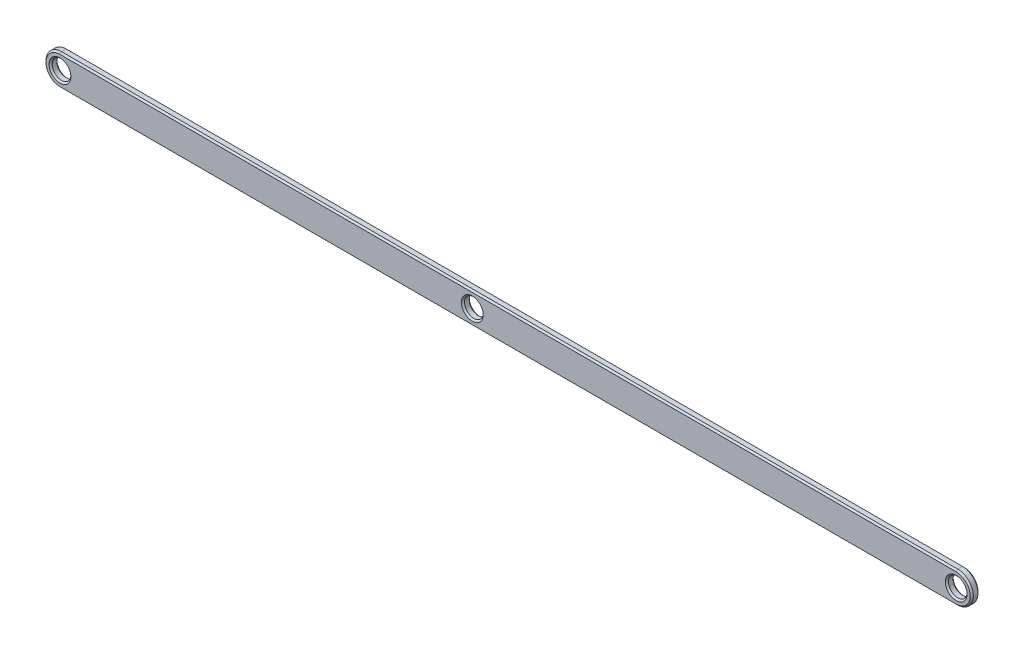
ISO-10303-21;
HEADER;
FILE_DESCRIPTION(('STEP AP214'),'2;1');
FILE_NAME('part.step','',(''),(''),'','','');
FILE_SCHEMA(('AUTOMOTIVE_DESIGN { 1 0 10303 214 1 1 1 1 }'));
ENDSEC;
DATA;
#1=APPLICATION_CONTEXT('core data for automotive mechanical design processes');
#2=APPLICATION_PROTOCOL_DEFINITION('international standard','automotive_design',2000,#1);
#3=PRODUCT_CONTEXT('',#1,'mechanical');
#4=PRODUCT('Part','Part','',(#3));
#5=PRODUCT_RELATED_PRODUCT_CATEGORY('part','',(#4));
#6=PRODUCT_DEFINITION_FORMATION('','',#4);
#7=PRODUCT_DEFINITION_CONTEXT('part definition',#1,'design');
#8=PRODUCT_DEFINITION('design','',#6,#7);
#9=PRODUCT_DEFINITION_SHAPE('','',#8);
#10=(LENGTH_UNIT() NAMED_UNIT(*) SI_UNIT(.MILLI.,.METRE.));
#11=(NAMED_UNIT(*) PLANE_ANGLE_UNIT() SI_UNIT($,.RADIAN.));
#12=(NAMED_UNIT(*) SI_UNIT($,.STERADIAN.) SOLID_ANGLE_UNIT());
#13=UNCERTAINTY_MEASURE_WITH_UNIT(LENGTH_MEASURE(1.E-05),#10,'distance_accuracy_value','');
#14=(GEOMETRIC_REPRESENTATION_CONTEXT(3) GLOBAL_UNCERTAINTY_ASSIGNED_CONTEXT((#13)) GLOBAL_UNIT_ASSIGNED_CONTEXT((#10,
#11,#12)) REPRESENTATION_CONTEXT('',''));
#15=CARTESIAN_POINT('',(0.,0.,0.));
#16=DIRECTION('',(0.,0.,1.));
#17=DIRECTION('',(1.,0.,0.));
#18=AXIS2_PLACEMENT_3D('',#15,#16,#17);
#19=CARTESIAN_POINT('',(-1440.,0.,25.));
#20=DIRECTION('',(0.,0.,1.));
#21=DIRECTION('',(1.,0.,0.));
#22=AXIS2_PLACEMENT_3D('',#19,#20,#21);
#23=PLANE('',#22);
#24=CARTESIAN_POINT('',(-115.,0.,25.));
#25=DIRECTION('',(0.,0.,1.));
#26=DIRECTION('',(1.,0.,0.));
#27=AXIS2_PLACEMENT_3D('',#24,#25,#26);
#28=CIRCLE('',#27,35.0000000000001);
#29=CARTESIAN_POINT('',(-79.9999999999998,0.,25.));
#30=VERTEX_POINT('',#29);
#31=EDGE_CURVE('E11',#30,#30,#28,.F.);
#32=ORIENTED_EDGE('',*,*,#31,.T.);
#33=EDGE_LOOP('',(#32));
#34=FACE_BOUND('',#33,.T.);
#35=CARTESIAN_POINT('',(-1440.,0.,25.));
#36=DIRECTION('',(0.,0.,1.));
#37=DIRECTION('',(1.,0.,0.));
#38=AXIS2_PLACEMENT_3D('',#35,#36,#37);
#39=CIRCLE('',#38,35.0000000000001);
#40=CARTESIAN_POINT('',(-1405.,0.,25.));
#41=VERTEX_POINT('',#40);
#42=EDGE_CURVE('E50',#41,#41,#39,.F.);
#43=ORIENTED_EDGE('',*,*,#42,.T.);
#44=EDGE_LOOP('',(#43));
#45=FACE_BOUND('',#44,.T.);
#46=CARTESIAN_POINT('',(1440.,3.52698278154438E-13,25.));
#47=DIRECTION('',(0.,0.,1.));
#48=DIRECTION('',(1.,0.,0.));
#49=AXIS2_PLACEMENT_3D('',#46,#47,#48);
#50=CIRCLE('',#49,45.0000000000008);
#51=CARTESIAN_POINT('',(1440.,-45.0000000000005,25.));
#52=VERTEX_POINT('',#51);
#53=CARTESIAN_POINT('',(1440.,45.0000000000012,25.));
#54=VERTEX_POINT('',#53);
#55=EDGE_CURVE('E58',#52,#54,#50,.T.);
#56=ORIENTED_EDGE('',*,*,#55,.T.);
#57=DIRECTION('',(-1.,0.,0.));
#58=VECTOR('',#57,1.);
#59=CARTESIAN_POINT('',(-1440.,45.0000000000008,25.));
#60=LINE('',#59,#58);
#61=CARTESIAN_POINT('',(-1440.,45.0000000000008,25.));
#62=VERTEX_POINT('',#61);
#63=EDGE_CURVE('E214',#54,#62,#60,.T.);
#64=ORIENTED_EDGE('',*,*,#63,.T.);
#65=CARTESIAN_POINT('',(-1440.,0.,25.));
#66=DIRECTION('',(0.,0.,1.));
#67=DIRECTION('',(1.,0.,0.));
#68=AXIS2_PLACEMENT_3D('',#65,#66,#67);
#69=CIRCLE('',#68,45.0000000000008);
#70=CARTESIAN_POINT('',(-1440.,-45.0000000000008,25.));
#71=VERTEX_POINT('',#70);
#72=EDGE_CURVE('E207',#62,#71,#69,.T.);
#73=ORIENTED_EDGE('',*,*,#72,.T.);
#74=DIRECTION('',(1.,0.,0.));
#75=VECTOR('',#74,1.);
#76=CARTESIAN_POINT('',(1440.,-45.0000000000005,25.));
#77=LINE('',#76,#75);
#78=EDGE_CURVE('E63',#71,#52,#77,.T.);
#79=ORIENTED_EDGE('',*,*,#78,.T.);
#80=EDGE_LOOP('',(#56,#64,#73,#79));
#81=FACE_BOUND('',#80,.T.);
#82=CARTESIAN_POINT('',(1440.,3.52698278154438E-13,25.));
#83=DIRECTION('',(0.,0.,1.));
#84=DIRECTION('',(1.,0.,0.));
#85=AXIS2_PLACEMENT_3D('',#82,#83,#84);
#86=CIRCLE('',#85,35.0000000000001);
#87=CARTESIAN_POINT('',(1475.,3.52698278154438E-13,25.));
#88=VERTEX_POINT('',#87);
#89=EDGE_CURVE('E203',#88,#88,#86,.F.);
#90=ORIENTED_EDGE('',*,*,#89,.T.);
#91=EDGE_LOOP('',(#90));
#92=FACE_BOUND('',#91,.T.);
#93=ADVANCED_FACE('F40',(#34,#45,#81,#92),#23,.T.);
#94=CARTESIAN_POINT('',(-1440.,0.,0.));
#95=DIRECTION('',(0.,0.,1.));
#96=DIRECTION('',(1.,0.,0.));
#97=AXIS2_PLACEMENT_3D('',#94,#95,#96);
#98=PLANE('',#97);
#99=CARTESIAN_POINT('',(-115.,0.,0.));
#100=DIRECTION('',(0.,0.,1.));
#101=DIRECTION('',(1.,0.,0.));
#102=AXIS2_PLACEMENT_3D('',#99,#100,#101);
#103=CIRCLE('',#102,35.0000000000001);
#104=CARTESIAN_POINT('',(-79.9999999999998,0.,0.));
#105=VERTEX_POINT('',#104);
#106=EDGE_CURVE('E151',#105,#105,#103,.T.);
#107=ORIENTED_EDGE('',*,*,#106,.T.);
#108=EDGE_LOOP('',(#107));
#109=FACE_BOUND('',#108,.T.);
#110=CARTESIAN_POINT('',(1440.,3.52698278154438E-13,0.));
#111=DIRECTION('',(0.,0.,1.));
#112=DIRECTION('',(1.,0.,0.));
#113=AXIS2_PLACEMENT_3D('',#110,#111,#112);
#114=CIRCLE('',#113,35.0000000000001);
#115=CARTESIAN_POINT('',(1475.,3.52698278154438E-13,0.));
#116=VERTEX_POINT('',#115);
#117=EDGE_CURVE('E143',#116,#116,#114,.T.);
#118=ORIENTED_EDGE('',*,*,#117,.T.);
#119=EDGE_LOOP('',(#118));
#120=FACE_BOUND('',#119,.T.);
#121=CARTESIAN_POINT('',(-1440.,0.,0.));
#122=DIRECTION('',(0.,0.,1.));
#123=DIRECTION('',(1.,0.,0.));
#124=AXIS2_PLACEMENT_3D('',#121,#122,#123);
#125=CIRCLE('',#124,35.0000000000001);
#126=CARTESIAN_POINT('',(-1405.,0.,0.));
#127=VERTEX_POINT('',#126);
#128=EDGE_CURVE('E138',#127,#127,#125,.T.);
#129=ORIENTED_EDGE('',*,*,#128,.T.);
#130=EDGE_LOOP('',(#129));
#131=FACE_BOUND('',#130,.T.);
#132=CARTESIAN_POINT('',(1440.,3.52698278154438E-13,0.));
#133=DIRECTION('',(0.,0.,1.));
#134=DIRECTION('',(1.,0.,0.));
#135=AXIS2_PLACEMENT_3D('',#132,#133,#134);
#136=CIRCLE('',#135,44.9999999999999);
#137=CARTESIAN_POINT('',(1440.,45.0000000000003,0.));
#138=VERTEX_POINT('',#137);
#139=CARTESIAN_POINT('',(1440.,-44.9999999999996,0.));
#140=VERTEX_POINT('',#139);
#141=EDGE_CURVE('E136',#138,#140,#136,.F.);
#142=ORIENTED_EDGE('',*,*,#141,.T.);
#143=DIRECTION('',(-1.,0.,0.));
#144=VECTOR('',#143,1.);
#145=CARTESIAN_POINT('',(-1440.,-44.9999999999999,0.));
#146=LINE('',#145,#144);
#147=CARTESIAN_POINT('',(-1440.,-44.9999999999999,0.));
#148=VERTEX_POINT('',#147);
#149=EDGE_CURVE('E113',#140,#148,#146,.T.);
#150=ORIENTED_EDGE('',*,*,#149,.T.);
#151=CARTESIAN_POINT('',(-1440.,0.,0.));
#152=DIRECTION('',(0.,0.,1.));
#153=DIRECTION('',(1.,0.,0.));
#154=AXIS2_PLACEMENT_3D('',#151,#152,#153);
#155=CIRCLE('',#154,44.9999999999999);
#156=CARTESIAN_POINT('',(-1440.,44.9999999999999,0.));
#157=VERTEX_POINT('',#156);
#158=EDGE_CURVE('E124',#148,#157,#155,.F.);
#159=ORIENTED_EDGE('',*,*,#158,.T.);
#160=DIRECTION('',(1.,0.,0.));
#161=VECTOR('',#160,1.);
#162=CARTESIAN_POINT('',(-1440.,44.9999999999999,0.));
#163=LINE('',#162,#161);
#164=EDGE_CURVE('E131',#157,#138,#163,.T.);
#165=ORIENTED_EDGE('',*,*,#164,.T.);
#166=EDGE_LOOP('',(#142,#150,#159,#165));
#167=FACE_BOUND('',#166,.T.);
#168=ADVANCED_FACE('F134',(#109,#120,#131,#167),#98,.F.);
#169=CARTESIAN_POINT('',(-1440.,0.,25.));
#170=DIRECTION('',(0.,0.,-1.));
#171=DIRECTION('',(-1.,0.,0.));
#172=AXIS2_PLACEMENT_3D('',#169,#170,#171);
#173=CYLINDRICAL_SURFACE('',#172,50.0000000000001);
#174=DIRECTION('',(0.,0.,-1.));
#175=VECTOR('',#174,1.);
#176=CARTESIAN_POINT('',(-1440.,50.,25.));
#177=LINE('',#176,#175);
#178=CARTESIAN_POINT('',(-1440.,50.,20.0000000000005));
#179=VERTEX_POINT('',#178);
#180=CARTESIAN_POINT('',(-1440.,50.,4.99999999999996));
#181=VERTEX_POINT('',#180);
#182=EDGE_CURVE('E227',#179,#181,#177,.T.);
#183=ORIENTED_EDGE('',*,*,#182,.T.);
#184=CARTESIAN_POINT('',(-1440.,0.,4.99999999999996));
#185=DIRECTION('',(0.,0.,1.));
#186=DIRECTION('',(1.,0.,0.));
#187=AXIS2_PLACEMENT_3D('',#184,#185,#186);
#188=CIRCLE('',#187,50.0000000000001);
#189=CARTESIAN_POINT('',(-1440.,-50.0000000000001,4.99999999999996));
#190=VERTEX_POINT('',#189);
#191=EDGE_CURVE('E200',#181,#190,#188,.T.);
#192=ORIENTED_EDGE('',*,*,#191,.T.);
#193=DIRECTION('',(0.,0.,-1.));
#194=VECTOR('',#193,1.);
#195=CARTESIAN_POINT('',(-1440.,-50.0000000000001,25.));
#196=LINE('',#195,#194);
#197=CARTESIAN_POINT('',(-1440.,-50.0000000000001,20.0000000000005));
#198=VERTEX_POINT('',#197);
#199=EDGE_CURVE('E132',#198,#190,#196,.T.);
#200=ORIENTED_EDGE('',*,*,#199,.F.);
#201=CARTESIAN_POINT('',(-1440.,0.,20.0000000000005));
#202=DIRECTION('',(0.,0.,1.));
#203=DIRECTION('',(1.,0.,0.));
#204=AXIS2_PLACEMENT_3D('',#201,#202,#203);
#205=CIRCLE('',#204,50.0000000000001);
#206=EDGE_CURVE('E197',#198,#179,#205,.F.);
#207=ORIENTED_EDGE('',*,*,#206,.T.);
#208=EDGE_LOOP('',(#183,#192,#200,#207));
#209=FACE_BOUND('',#208,.T.);
#210=ADVANCED_FACE('F257',(#209),#173,.T.);
#211=CARTESIAN_POINT('',(1440.,-49.9999999999997,25.));
#212=DIRECTION('',(0.,1.,0.));
#213=DIRECTION('',(-1.,0.,0.));
#214=AXIS2_PLACEMENT_3D('',#211,#212,#213);
#215=PLANE('',#214);
#216=ORIENTED_EDGE('',*,*,#199,.T.);
#217=DIRECTION('',(1.,0.,0.));
#218=VECTOR('',#217,1.);
#219=CARTESIAN_POINT('',(1440.,-49.9999999999997,4.99999999999996));
#220=LINE('',#219,#218);
#221=CARTESIAN_POINT('',(1440.,-49.9999999999997,4.99999999999996));
#222=VERTEX_POINT('',#221);
#223=EDGE_CURVE('E116',#190,#222,#220,.T.);
#224=ORIENTED_EDGE('',*,*,#223,.T.);
#225=DIRECTION('',(0.,0.,-1.));
#226=VECTOR('',#225,1.);
#227=CARTESIAN_POINT('',(1440.,-49.9999999999997,25.));
#228=LINE('',#227,#226);
#229=CARTESIAN_POINT('',(1440.,-49.9999999999997,20.0000000000005));
#230=VERTEX_POINT('',#229);
#231=EDGE_CURVE('E254',#230,#222,#228,.T.);
#232=ORIENTED_EDGE('',*,*,#231,.F.);
#233=DIRECTION('',(-1.,0.,0.));
#234=VECTOR('',#233,1.);
#235=CARTESIAN_POINT('',(-1440.,-50.0000000000001,20.0000000000005));
#236=LINE('',#235,#234);
#237=EDGE_CURVE('E179',#230,#198,#236,.T.);
#238=ORIENTED_EDGE('',*,*,#237,.T.);
#239=EDGE_LOOP('',(#216,#224,#232,#238));
#240=FACE_BOUND('',#239,.T.);
#241=ADVANCED_FACE('F252',(#240),#215,.F.);
#242=CARTESIAN_POINT('',(1440.,3.52698278154438E-13,25.));
#243=DIRECTION('',(0.,0.,-1.));
#244=DIRECTION('',(-1.,0.,0.));
#245=AXIS2_PLACEMENT_3D('',#242,#243,#244);
#246=CYLINDRICAL_SURFACE('',#245,50.0000000000001);
#247=ORIENTED_EDGE('',*,*,#231,.T.);
#248=CARTESIAN_POINT('',(1440.,3.52698278154438E-13,4.99999999999996));
#249=DIRECTION('',(0.,0.,1.));
#250=DIRECTION('',(1.,0.,0.));
#251=AXIS2_PLACEMENT_3D('',#248,#249,#250);
#252=CIRCLE('',#251,50.0000000000001);
#253=CARTESIAN_POINT('',(1440.,50.0000000000004,4.99999999999996));
#254=VERTEX_POINT('',#253);
#255=EDGE_CURVE('E187',#222,#254,#252,.T.);
#256=ORIENTED_EDGE('',*,*,#255,.T.);
#257=DIRECTION('',(0.,0.,-1.));
#258=VECTOR('',#257,1.);
#259=CARTESIAN_POINT('',(1440.,50.0000000000004,25.));
#260=LINE('',#259,#258);
#261=CARTESIAN_POINT('',(1440.,50.0000000000004,20.0000000000005));
#262=VERTEX_POINT('',#261);
#263=EDGE_CURVE('E262',#262,#254,#260,.T.);
#264=ORIENTED_EDGE('',*,*,#263,.F.);
#265=CARTESIAN_POINT('',(1440.,3.52698278154438E-13,20.0000000000005));
#266=DIRECTION('',(0.,0.,1.));
#267=DIRECTION('',(1.,0.,0.));
#268=AXIS2_PLACEMENT_3D('',#265,#266,#267);
#269=CIRCLE('',#268,50.0000000000001);
#270=EDGE_CURVE('E184',#262,#230,#269,.F.);
#271=ORIENTED_EDGE('',*,*,#270,.T.);
#272=EDGE_LOOP('',(#247,#256,#264,#271));
#273=FACE_BOUND('',#272,.T.);
#274=ADVANCED_FACE('F276',(#273),#246,.T.);
#275=CARTESIAN_POINT('',(1440.,50.0000000000004,25.));
#276=DIRECTION('',(0.,-1.,0.));
#277=DIRECTION('',(1.,0.,0.));
#278=AXIS2_PLACEMENT_3D('',#275,#276,#277);
#279=PLANE('',#278);
#280=ORIENTED_EDGE('',*,*,#263,.T.);
#281=DIRECTION('',(-1.,0.,0.));
#282=VECTOR('',#281,1.);
#283=CARTESIAN_POINT('',(1440.,50.0000000000004,4.99999999999996));
#284=LINE('',#283,#282);
#285=EDGE_CURVE('E194',#254,#181,#284,.T.);
#286=ORIENTED_EDGE('',*,*,#285,.T.);
#287=ORIENTED_EDGE('',*,*,#182,.F.);
#288=DIRECTION('',(1.,0.,0.));
#289=VECTOR('',#288,1.);
#290=CARTESIAN_POINT('',(1440.,50.0000000000004,20.0000000000005));
#291=LINE('',#290,#289);
#292=EDGE_CURVE('E190',#179,#262,#291,.T.);
#293=ORIENTED_EDGE('',*,*,#292,.T.);
#294=EDGE_LOOP('',(#280,#286,#287,#293));
#295=FACE_BOUND('',#294,.T.);
#296=ADVANCED_FACE('F282',(#295),#279,.F.);
#297=CARTESIAN_POINT('',(-1440.,0.,25.));
#298=DIRECTION('',(0.,0.,-1.));
#299=DIRECTION('',(-1.,0.,0.));
#300=AXIS2_PLACEMENT_3D('',#297,#298,#299);
#301=CYLINDRICAL_SURFACE('',#300,30.);
#302=CARTESIAN_POINT('',(-1440.,0.,5.0000000000002));
#303=DIRECTION('',(0.,0.,1.));
#304=DIRECTION('',(1.,0.,0.));
#305=AXIS2_PLACEMENT_3D('',#302,#303,#304);
#306=CIRCLE('',#305,30.);
#307=CARTESIAN_POINT('',(-1410.,0.,5.0000000000002));
#308=VERTEX_POINT('',#307);
#309=EDGE_CURVE('E175',#308,#308,#306,.F.);
#310=ORIENTED_EDGE('',*,*,#309,.T.);
#311=EDGE_LOOP('',(#310));
#312=FACE_BOUND('',#311,.T.);
#313=CARTESIAN_POINT('',(-1440.,0.,20.0000000000002));
#314=DIRECTION('',(0.,0.,1.));
#315=DIRECTION('',(1.,0.,0.));
#316=AXIS2_PLACEMENT_3D('',#313,#314,#315);
#317=CIRCLE('',#316,30.);
#318=CARTESIAN_POINT('',(-1410.,0.,20.0000000000002));
#319=VERTEX_POINT('',#318);
#320=EDGE_CURVE('E171',#319,#319,#317,.T.);
#321=ORIENTED_EDGE('',*,*,#320,.T.);
#322=EDGE_LOOP('',(#321));
#323=FACE_BOUND('',#322,.T.);
#324=ADVANCED_FACE('F301',(#312,#323),#301,.F.);
#325=CARTESIAN_POINT('',(1440.,3.52698278154438E-13,25.));
#326=DIRECTION('',(0.,0.,-1.));
#327=DIRECTION('',(-1.,0.,0.));
#328=AXIS2_PLACEMENT_3D('',#325,#326,#327);
#329=CYLINDRICAL_SURFACE('',#328,30.);
#330=CARTESIAN_POINT('',(1440.,3.52698278154438E-13,5.0000000000002));
#331=DIRECTION('',(0.,0.,1.));
#332=DIRECTION('',(1.,0.,0.));
#333=AXIS2_PLACEMENT_3D('',#330,#331,#332);
#334=CIRCLE('',#333,30.);
#335=CARTESIAN_POINT('',(1470.,3.52698278154438E-13,5.0000000000002));
#336=VERTEX_POINT('',#335);
#337=EDGE_CURVE('E167',#336,#336,#334,.F.);
#338=ORIENTED_EDGE('',*,*,#337,.T.);
#339=EDGE_LOOP('',(#338));
#340=FACE_BOUND('',#339,.T.);
#341=CARTESIAN_POINT('',(1440.,3.52698278154438E-13,20.0000000000002));
#342=DIRECTION('',(0.,0.,1.));
#343=DIRECTION('',(1.,0.,0.));
#344=AXIS2_PLACEMENT_3D('',#341,#342,#343);
#345=CIRCLE('',#344,30.);
#346=CARTESIAN_POINT('',(1470.,3.52698278154438E-13,20.0000000000002));
#347=VERTEX_POINT('',#346);
#348=EDGE_CURVE('E163',#347,#347,#345,.T.);
#349=ORIENTED_EDGE('',*,*,#348,.T.);
#350=EDGE_LOOP('',(#349));
#351=FACE_BOUND('',#350,.T.);
#352=ADVANCED_FACE('F298',(#340,#351),#329,.F.);
#353=CARTESIAN_POINT('',(-115.,0.,25.));
#354=DIRECTION('',(0.,0.,-1.));
#355=DIRECTION('',(-1.,0.,0.));
#356=AXIS2_PLACEMENT_3D('',#353,#354,#355);
#357=CYLINDRICAL_SURFACE('',#356,30.0000000000001);
#358=CARTESIAN_POINT('',(-115.,0.,5.00000000000031));
#359=DIRECTION('',(0.,0.,1.));
#360=DIRECTION('',(1.,0.,0.));
#361=AXIS2_PLACEMENT_3D('',#358,#359,#360);
#362=CIRCLE('',#361,30.0000000000001);
#363=CARTESIAN_POINT('',(-84.9999999999999,0.,5.00000000000031));
#364=VERTEX_POINT('',#363);
#365=EDGE_CURVE('E159',#364,#364,#362,.F.);
#366=ORIENTED_EDGE('',*,*,#365,.T.);
#367=EDGE_LOOP('',(#366));
#368=FACE_BOUND('',#367,.T.);
#369=CARTESIAN_POINT('',(-115.,0.,20.0000000000003));
#370=DIRECTION('',(0.,0.,1.));
#371=DIRECTION('',(1.,0.,0.));
#372=AXIS2_PLACEMENT_3D('',#369,#370,#371);
#373=CIRCLE('',#372,30.0000000000001);
#374=CARTESIAN_POINT('',(-84.9999999999999,0.,20.0000000000003));
#375=VERTEX_POINT('',#374);
#376=EDGE_CURVE('E155',#375,#375,#373,.T.);
#377=ORIENTED_EDGE('',*,*,#376,.T.);
#378=EDGE_LOOP('',(#377));
#379=FACE_BOUND('',#378,.T.);
#380=ADVANCED_FACE('F300',(#368,#379),#357,.F.);
#381=CARTESIAN_POINT('',(-115.,0.,0.));
#382=DIRECTION('',(0.,0.,-1.));
#383=DIRECTION('',(-1.,0.,0.));
#384=AXIS2_PLACEMENT_3D('',#381,#382,#383);
#385=CONICAL_SURFACE('',#384,35.0000000000001,0.785398163397426);
#386=ORIENTED_EDGE('',*,*,#365,.F.);
#387=EDGE_LOOP('',(#386));
#388=FACE_BOUND('',#387,.T.);
#389=ORIENTED_EDGE('',*,*,#106,.F.);
#390=EDGE_LOOP('',(#389));
#391=FACE_BOUND('',#390,.T.);
#392=ADVANCED_FACE('F308',(#388,#391),#385,.F.);
#393=CARTESIAN_POINT('',(1440.,3.52698278154438E-13,0.));
#394=DIRECTION('',(0.,0.,-1.));
#395=DIRECTION('',(-1.,0.,0.));
#396=AXIS2_PLACEMENT_3D('',#393,#394,#395);
#397=CONICAL_SURFACE('',#396,35.0000000000001,0.785398163397438);
#398=ORIENTED_EDGE('',*,*,#337,.F.);
#399=EDGE_LOOP('',(#398));
#400=FACE_BOUND('',#399,.T.);
#401=ORIENTED_EDGE('',*,*,#117,.F.);
#402=EDGE_LOOP('',(#401));
#403=FACE_BOUND('',#402,.T.);
#404=ADVANCED_FACE('F327',(#400,#403),#397,.F.);
#405=CARTESIAN_POINT('',(-1440.,0.,0.));
#406=DIRECTION('',(0.,0.,-1.));
#407=DIRECTION('',(-1.,0.,0.));
#408=AXIS2_PLACEMENT_3D('',#405,#406,#407);
#409=CONICAL_SURFACE('',#408,35.0000000000001,0.785398163397438);
#410=ORIENTED_EDGE('',*,*,#309,.F.);
#411=EDGE_LOOP('',(#410));
#412=FACE_BOUND('',#411,.T.);
#413=ORIENTED_EDGE('',*,*,#128,.F.);
#414=EDGE_LOOP('',(#413));
#415=FACE_BOUND('',#414,.T.);
#416=ADVANCED_FACE('F331',(#412,#415),#409,.F.);
#417=CARTESIAN_POINT('',(1440.,50.0000000000004,4.99999999999996));
#418=DIRECTION('',(0.,-0.707106781186536,0.707106781186559));
#419=DIRECTION('',(-1.,0.,0.));
#420=AXIS2_PLACEMENT_3D('',#417,#418,#419);
#421=PLANE('',#420);
#422=DIRECTION('',(0.,0.707106781186559,0.707106781186536));
#423=VECTOR('',#422,1.);
#424=CARTESIAN_POINT('',(1440.,45.0000000000003,0.));
#425=LINE('',#424,#423);
#426=EDGE_CURVE('E120',#138,#254,#425,.T.);
#427=ORIENTED_EDGE('',*,*,#426,.F.);
#428=ORIENTED_EDGE('',*,*,#164,.F.);
#429=DIRECTION('',(0.,-0.707106781186559,-0.707106781186536));
#430=VECTOR('',#429,1.);
#431=CARTESIAN_POINT('',(-1440.,50.,4.99999999999996));
#432=LINE('',#431,#430);
#433=EDGE_CURVE('E127',#181,#157,#432,.T.);
#434=ORIENTED_EDGE('',*,*,#433,.F.);
#435=ORIENTED_EDGE('',*,*,#285,.F.);
#436=EDGE_LOOP('',(#427,#428,#434,#435));
#437=FACE_BOUND('',#436,.T.);
#438=ADVANCED_FACE('F269',(#437),#421,.F.);
#439=CARTESIAN_POINT('',(-1440.,0.,4.99999999999996));
#440=DIRECTION('',(0.,0.,1.));
#441=DIRECTION('',(1.,0.,0.));
#442=AXIS2_PLACEMENT_3D('',#439,#440,#441);
#443=CONICAL_SURFACE('',#442,50.0000000000001,0.785398163397464);
#444=ORIENTED_EDGE('',*,*,#433,.T.);
#445=ORIENTED_EDGE('',*,*,#158,.F.);
#446=DIRECTION('',(0.,0.707106781186559,-0.707106781186536));
#447=VECTOR('',#446,1.);
#448=CARTESIAN_POINT('',(-1440.,-50.0000000000001,4.99999999999996));
#449=LINE('',#448,#447);
#450=EDGE_CURVE('E109',#190,#148,#449,.T.);
#451=ORIENTED_EDGE('',*,*,#450,.F.);
#452=ORIENTED_EDGE('',*,*,#191,.F.);
#453=EDGE_LOOP('',(#444,#445,#451,#452));
#454=FACE_BOUND('',#453,.T.);
#455=ADVANCED_FACE('F125',(#454),#443,.T.);
#456=CARTESIAN_POINT('',(1440.,3.52698278154438E-13,4.99999999999996));
#457=DIRECTION('',(0.,0.,1.));
#458=DIRECTION('',(1.,0.,0.));
#459=AXIS2_PLACEMENT_3D('',#456,#457,#458);
#460=CONICAL_SURFACE('',#459,50.0000000000001,0.785398163397464);
#461=ORIENTED_EDGE('',*,*,#426,.T.);
#462=ORIENTED_EDGE('',*,*,#255,.F.);
#463=DIRECTION('',(0.,-0.707106781186559,0.707106781186536));
#464=VECTOR('',#463,1.);
#465=CARTESIAN_POINT('',(1440.,-44.9999999999996,0.));
#466=LINE('',#465,#464);
#467=EDGE_CURVE('E121',#140,#222,#466,.T.);
#468=ORIENTED_EDGE('',*,*,#467,.F.);
#469=ORIENTED_EDGE('',*,*,#141,.F.);
#470=EDGE_LOOP('',(#461,#462,#468,#469));
#471=FACE_BOUND('',#470,.T.);
#472=ADVANCED_FACE('F272',(#471),#460,.T.);
#473=CARTESIAN_POINT('',(1440.,-49.9999999999997,4.99999999999996));
#474=DIRECTION('',(0.,0.707106781186536,0.707106781186559));
#475=DIRECTION('',(1.,0.,0.));
#476=AXIS2_PLACEMENT_3D('',#473,#474,#475);
#477=PLANE('',#476);
#478=ORIENTED_EDGE('',*,*,#450,.T.);
#479=ORIENTED_EDGE('',*,*,#149,.F.);
#480=ORIENTED_EDGE('',*,*,#467,.T.);
#481=ORIENTED_EDGE('',*,*,#223,.F.);
#482=EDGE_LOOP('',(#478,#479,#480,#481));
#483=FACE_BOUND('',#482,.T.);
#484=ADVANCED_FACE('F111',(#483),#477,.F.);
#485=CARTESIAN_POINT('',(-115.,0.,20.0000000000003));
#486=DIRECTION('',(0.,0.,1.));
#487=DIRECTION('',(1.,0.,0.));
#488=AXIS2_PLACEMENT_3D('',#485,#486,#487);
#489=CONICAL_SURFACE('',#488,30.0000000000001,0.785398163397482);
#490=ORIENTED_EDGE('',*,*,#31,.F.);
#491=EDGE_LOOP('',(#490));
#492=FACE_BOUND('',#491,.T.);
#493=ORIENTED_EDGE('',*,*,#376,.F.);
#494=EDGE_LOOP('',(#493));
#495=FACE_BOUND('',#494,.T.);
#496=ADVANCED_FACE('F338',(#492,#495),#489,.F.);
#497=CARTESIAN_POINT('',(-1440.,0.,20.0000000000002));
#498=DIRECTION('',(0.,0.,1.));
#499=DIRECTION('',(1.,0.,0.));
#500=AXIS2_PLACEMENT_3D('',#497,#498,#499);
#501=CONICAL_SURFACE('',#500,30.,0.785398163397482);
#502=ORIENTED_EDGE('',*,*,#42,.F.);
#503=EDGE_LOOP('',(#502));
#504=FACE_BOUND('',#503,.T.);
#505=ORIENTED_EDGE('',*,*,#320,.F.);
#506=EDGE_LOOP('',(#505));
#507=FACE_BOUND('',#506,.T.);
#508=ADVANCED_FACE('F347',(#504,#507),#501,.F.);
#509=CARTESIAN_POINT('',(-1440.,-45.0000000000008,25.));
#510=DIRECTION('',(0.,-0.707106781186568,0.707106781186527));
#511=DIRECTION('',(-1.,0.,0.));
#512=AXIS2_PLACEMENT_3D('',#509,#510,#511);
#513=PLANE('',#512);
#514=DIRECTION('',(0.,0.707106781186527,0.707106781186568));
#515=VECTOR('',#514,1.);
#516=CARTESIAN_POINT('',(-1440.,-50.0000000000001,20.0000000000005));
#517=LINE('',#516,#515);
#518=EDGE_CURVE('E233',#198,#71,#517,.T.);
#519=ORIENTED_EDGE('',*,*,#518,.F.);
#520=ORIENTED_EDGE('',*,*,#237,.F.);
#521=DIRECTION('',(0.,-0.707106781186527,-0.707106781186568));
#522=VECTOR('',#521,1.);
#523=CARTESIAN_POINT('',(1440.,-45.0000000000005,25.));
#524=LINE('',#523,#522);
#525=EDGE_CURVE('E44',#52,#230,#524,.T.);
#526=ORIENTED_EDGE('',*,*,#525,.F.);
#527=ORIENTED_EDGE('',*,*,#78,.F.);
#528=EDGE_LOOP('',(#519,#520,#526,#527));
#529=FACE_BOUND('',#528,.T.);
#530=ADVANCED_FACE('F247',(#529),#513,.T.);
#531=CARTESIAN_POINT('',(1440.,3.52698278154438E-13,25.));
#532=DIRECTION('',(0.,0.,-1.));
#533=DIRECTION('',(-1.,0.,0.));
#534=AXIS2_PLACEMENT_3D('',#531,#532,#533);
#535=CONICAL_SURFACE('',#534,45.0000000000008,0.78539816339742);
#536=ORIENTED_EDGE('',*,*,#525,.T.);
#537=ORIENTED_EDGE('',*,*,#270,.F.);
#538=DIRECTION('',(0.,0.707106781186527,-0.707106781186568));
#539=VECTOR('',#538,1.);
#540=CARTESIAN_POINT('',(1440.,45.0000000000012,25.));
#541=LINE('',#540,#539);
#542=EDGE_CURVE('E231',#54,#262,#541,.T.);
#543=ORIENTED_EDGE('',*,*,#542,.F.);
#544=ORIENTED_EDGE('',*,*,#55,.F.);
#545=EDGE_LOOP('',(#536,#537,#543,#544));
#546=FACE_BOUND('',#545,.T.);
#547=ADVANCED_FACE('F244',(#546),#535,.T.);
#548=CARTESIAN_POINT('',(-1440.,0.,25.));
#549=DIRECTION('',(0.,0.,-1.));
#550=DIRECTION('',(-1.,0.,0.));
#551=AXIS2_PLACEMENT_3D('',#548,#549,#550);
#552=CONICAL_SURFACE('',#551,45.0000000000008,0.78539816339742);
#553=ORIENTED_EDGE('',*,*,#518,.T.);
#554=ORIENTED_EDGE('',*,*,#72,.F.);
#555=DIRECTION('',(0.,-0.707106781186527,0.707106781186568));
#556=VECTOR('',#555,1.);
#557=CARTESIAN_POINT('',(-1440.,50.0000000000001,20.0000000000005));
#558=LINE('',#557,#556);
#559=EDGE_CURVE('E228',#179,#62,#558,.T.);
#560=ORIENTED_EDGE('',*,*,#559,.F.);
#561=ORIENTED_EDGE('',*,*,#206,.F.);
#562=EDGE_LOOP('',(#553,#554,#560,#561));
#563=FACE_BOUND('',#562,.T.);
#564=ADVANCED_FACE('F287',(#563),#552,.T.);
#565=CARTESIAN_POINT('',(-1440.,45.0000000000008,25.));
#566=DIRECTION('',(0.,0.707106781186568,0.707106781186527));
#567=DIRECTION('',(1.,0.,0.));
#568=AXIS2_PLACEMENT_3D('',#565,#566,#567);
#569=PLANE('',#568);
#570=ORIENTED_EDGE('',*,*,#542,.T.);
#571=ORIENTED_EDGE('',*,*,#292,.F.);
#572=ORIENTED_EDGE('',*,*,#559,.T.);
#573=ORIENTED_EDGE('',*,*,#63,.F.);
#574=EDGE_LOOP('',(#570,#571,#572,#573));
#575=FACE_BOUND('',#574,.T.);
#576=ADVANCED_FACE('F285',(#575),#569,.T.);
#577=CARTESIAN_POINT('',(1440.,3.52698278154438E-13,20.0000000000002));
#578=DIRECTION('',(0.,0.,1.));
#579=DIRECTION('',(1.,0.,0.));
#580=AXIS2_PLACEMENT_3D('',#577,#578,#579);
#581=CONICAL_SURFACE('',#580,30.,0.785398163397482);
#582=ORIENTED_EDGE('',*,*,#89,.F.);
#583=EDGE_LOOP('',(#582));
#584=FACE_BOUND('',#583,.T.);
#585=ORIENTED_EDGE('',*,*,#348,.F.);
#586=EDGE_LOOP('',(#585));
#587=FACE_BOUND('',#586,.T.);
#588=ADVANCED_FACE('F42',(#584,#587),#581,.F.);
#589=CLOSED_SHELL('',(#93,#168,#210,#241,#274,#296,#324,#352,#380,#392,#404,#416,#438,#455,#472,
#484,#496,#508,#530,#547,#564,#576,#588));
#590=MANIFOLD_SOLID_BREP('B2',#589);
#591=ADVANCED_BREP_SHAPE_REPRESENTATION('',(#18,#590),#14);
#592=SHAPE_DEFINITION_REPRESENTATION(#9,#591);
ENDSEC;
END-ISO-10303-21;
